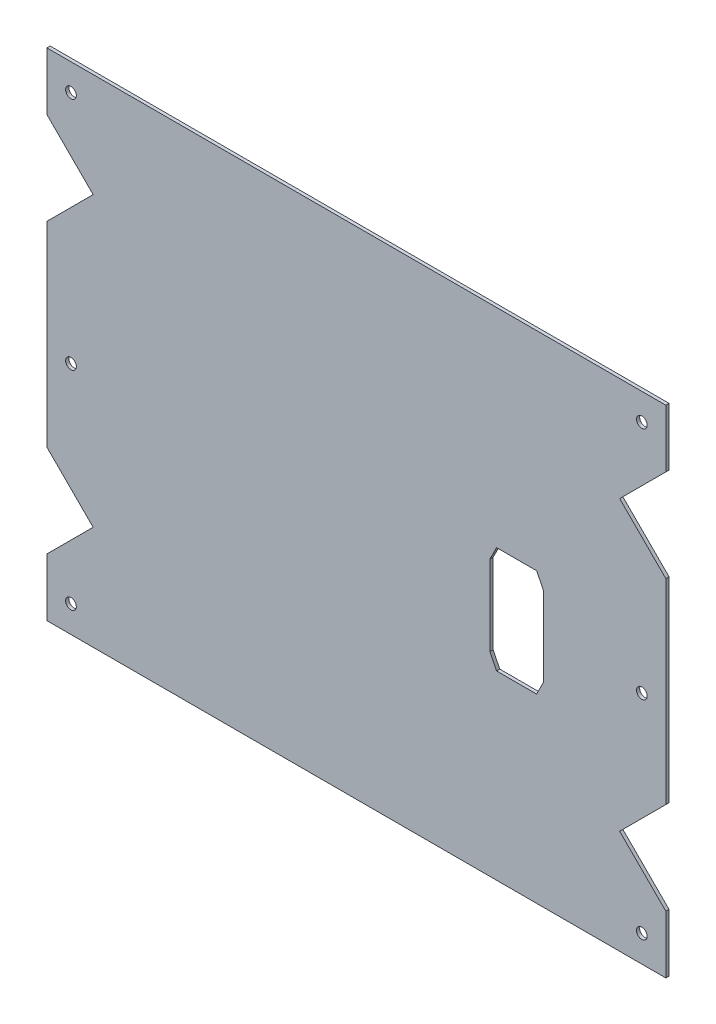
ISO-10303-21;
HEADER;
FILE_DESCRIPTION(('STEP AP214'),'2;1');
FILE_NAME('part.step','',(''),(''),'','','');
FILE_SCHEMA(('AUTOMOTIVE_DESIGN { 1 0 10303 214 1 1 1 1 }'));
ENDSEC;
DATA;
#1=APPLICATION_CONTEXT('core data for automotive mechanical design processes');
#2=APPLICATION_PROTOCOL_DEFINITION('international standard','automotive_design',2000,#1);
#3=PRODUCT_CONTEXT('',#1,'mechanical');
#4=PRODUCT('Part','Part','',(#3));
#5=PRODUCT_RELATED_PRODUCT_CATEGORY('part','',(#4));
#6=PRODUCT_DEFINITION_FORMATION('','',#4);
#7=PRODUCT_DEFINITION_CONTEXT('part definition',#1,'design');
#8=PRODUCT_DEFINITION('design','',#6,#7);
#9=PRODUCT_DEFINITION_SHAPE('','',#8);
#10=(LENGTH_UNIT() NAMED_UNIT(*) SI_UNIT(.MILLI.,.METRE.));
#11=(NAMED_UNIT(*) PLANE_ANGLE_UNIT() SI_UNIT($,.RADIAN.));
#12=(NAMED_UNIT(*) SI_UNIT($,.STERADIAN.) SOLID_ANGLE_UNIT());
#13=UNCERTAINTY_MEASURE_WITH_UNIT(LENGTH_MEASURE(1.E-05),#10,'distance_accuracy_value','');
#14=(GEOMETRIC_REPRESENTATION_CONTEXT(3) GLOBAL_UNCERTAINTY_ASSIGNED_CONTEXT((#13)) GLOBAL_UNIT_ASSIGNED_CONTEXT((#10,
#11,#12)) REPRESENTATION_CONTEXT('',''));
#15=CARTESIAN_POINT('',(0.,0.,0.));
#16=DIRECTION('',(0.,0.,1.));
#17=DIRECTION('',(1.,0.,0.));
#18=AXIS2_PLACEMENT_3D('',#15,#16,#17);
#19=CARTESIAN_POINT('',(0.,0.,-1.2));
#20=DIRECTION('',(0.,0.,-1.));
#21=DIRECTION('',(-1.,0.,0.));
#22=AXIS2_PLACEMENT_3D('',#19,#20,#21);
#23=PLANE('',#22);
#24=DIRECTION('',(-0.707106781186547,-0.707106781186549,0.));
#25=VECTOR('',#24,1.);
#26=CARTESIAN_POINT('',(-99.8236343638063,52.7098466094067,-1.20000000000003));
#27=LINE('',#26,#25);
#28=CARTESIAN_POINT('',(-98.5899637913098,53.9435171819032,-1.20000000000004));
#29=VERTEX_POINT('',#28);
#30=CARTESIAN_POINT('',(-115.887034363806,36.6464466094067,-1.20000000000015));
#31=VERTEX_POINT('',#30);
#32=EDGE_CURVE('E710',#29,#31,#27,.T.);
#33=ORIENTED_EDGE('',*,*,#32,.F.);
#34=DIRECTION('',(0.707106781186547,-0.707106781186548,0.));
#35=VECTOR('',#34,1.);
#36=CARTESIAN_POINT('',(-128.81936983357,84.1729232241631,-1.20000000000049));
#37=LINE('',#36,#35);
#38=CARTESIAN_POINT('',(-115.887034363806,71.2405877543997,-1.20000000000029));
#39=VERTEX_POINT('',#38);
#40=EDGE_CURVE('E725',#39,#29,#37,.T.);
#41=ORIENTED_EDGE('',*,*,#40,.F.);
#42=DIRECTION('',(0.,1.,0.));
#43=VECTOR('',#42,1.);
#44=CARTESIAN_POINT('',(-115.887034363806,54.0870343638061,-1.20000000000013));
#45=LINE('',#44,#43);
#46=CARTESIAN_POINT('',(-115.887034363806,92.8870343638064,-1.20000000000048));
#47=VERTEX_POINT('',#46);
#48=EDGE_CURVE('E721',#39,#47,#45,.T.);
#49=ORIENTED_EDGE('',*,*,#48,.T.);
#50=DIRECTION('',(1.,0.,0.));
#51=VECTOR('',#50,1.);
#52=CARTESIAN_POINT('',(-152.887034363806,92.8870343638063,-1.20000000000072));
#53=LINE('',#52,#51);
#54=CARTESIAN_POINT('',(115.887034363806,92.8870343638064,-1.20000000000044));
#55=VERTEX_POINT('',#54);
#56=EDGE_CURVE('E752',#47,#55,#53,.T.);
#57=ORIENTED_EDGE('',*,*,#56,.T.);
#58=DIRECTION('',(0.,-1.,0.));
#59=VECTOR('',#58,1.);
#60=CARTESIAN_POINT('',(115.887034363806,54.0870343638061,-1.20000000000009));
#61=LINE('',#60,#59);
#62=CARTESIAN_POINT('',(115.887034363806,71.2405877543997,-1.20000000000025));
#63=VERTEX_POINT('',#62);
#64=EDGE_CURVE('E746',#55,#63,#61,.T.);
#65=ORIENTED_EDGE('',*,*,#64,.T.);
#66=DIRECTION('',(0.707106781186547,0.707106781186548,0.));
#67=VECTOR('',#66,1.);
#68=CARTESIAN_POINT('',(99.8236343638063,55.1771877543997,-1.19999999999999));
#69=LINE('',#68,#67);
#70=CARTESIAN_POINT('',(98.5899637913099,53.9435171819032,-1.19999999999997));
#71=VERTEX_POINT('',#70);
#72=EDGE_CURVE('E744',#71,#63,#69,.T.);
#73=ORIENTED_EDGE('',*,*,#72,.F.);
#74=DIRECTION('',(-0.707106781186546,0.707106781186549,0.));
#75=VECTOR('',#74,1.);
#76=CARTESIAN_POINT('',(175.231805465845,-22.6983244926323,-1.20000000000062));
#77=LINE('',#76,#75);
#78=CARTESIAN_POINT('',(115.887034363806,36.6464466094067,-1.20000000000016));
#79=VERTEX_POINT('',#78);
#80=EDGE_CURVE('E860',#79,#71,#77,.T.);
#81=ORIENTED_EDGE('',*,*,#80,.F.);
#82=DIRECTION('',(0.,-1.,0.));
#83=VECTOR('',#82,1.);
#84=CARTESIAN_POINT('',(115.887034363806,0.,-1.20000000000017));
#85=LINE('',#84,#83);
#86=CARTESIAN_POINT('',(115.887034363806,-36.6464466094066,-1.20000000000019));
#87=VERTEX_POINT('',#86);
#88=EDGE_CURVE('E866',#79,#87,#85,.T.);
#89=ORIENTED_EDGE('',*,*,#88,.T.);
#90=DIRECTION('',(0.707106781186546,0.707106781186549,0.));
#91=VECTOR('',#90,1.);
#92=CARTESIAN_POINT('',(99.8236343638063,-52.7098466094067,-1.20000000000009));
#93=LINE('',#92,#91);
#94=CARTESIAN_POINT('',(98.5899637913099,-53.9435171819032,-1.20000000000009));
#95=VERTEX_POINT('',#94);
#96=EDGE_CURVE('E851',#95,#87,#93,.T.);
#97=ORIENTED_EDGE('',*,*,#96,.F.);
#98=DIRECTION('',(-0.707106781186547,0.707106781186548,0.));
#99=VECTOR('',#98,1.);
#100=CARTESIAN_POINT('',(128.81936983357,-84.1729232241631,-1.20000000000045));
#101=LINE('',#100,#99);
#102=CARTESIAN_POINT('',(115.887034363806,-71.2405877543996,-1.20000000000028));
#103=VERTEX_POINT('',#102);
#104=EDGE_CURVE('E778',#103,#95,#101,.T.);
#105=ORIENTED_EDGE('',*,*,#104,.F.);
#106=DIRECTION('',(0.,-1.,0.));
#107=VECTOR('',#106,1.);
#108=CARTESIAN_POINT('',(115.887034363806,-54.0870343638062,-1.20000000000015));
#109=LINE('',#108,#107);
#110=CARTESIAN_POINT('',(115.887034363806,-92.8870343638064,-1.20000000000044));
#111=VERTEX_POINT('',#110);
#112=EDGE_CURVE('E789',#103,#111,#109,.T.);
#113=ORIENTED_EDGE('',*,*,#112,.T.);
#114=DIRECTION('',(-1.,0.,0.));
#115=VECTOR('',#114,1.);
#116=CARTESIAN_POINT('',(-152.887034363806,-92.8870343638063,-1.20000000000063));
#117=LINE('',#116,#115);
#118=CARTESIAN_POINT('',(-115.887034363806,-92.8870343638063,-1.20000000000039));
#119=VERTEX_POINT('',#118);
#120=EDGE_CURVE('E798',#111,#119,#117,.T.);
#121=ORIENTED_EDGE('',*,*,#120,.T.);
#122=DIRECTION('',(0.,1.,0.));
#123=VECTOR('',#122,1.);
#124=CARTESIAN_POINT('',(-115.887034363806,-54.0870343638059,-1.19999999999999));
#125=LINE('',#124,#123);
#126=CARTESIAN_POINT('',(-115.887034363806,-71.2405877543997,-1.20000000000017));
#127=VERTEX_POINT('',#126);
#128=EDGE_CURVE('E795',#119,#127,#125,.T.);
#129=ORIENTED_EDGE('',*,*,#128,.T.);
#130=DIRECTION('',(-0.707106781186547,-0.707106781186548,0.));
#131=VECTOR('',#130,1.);
#132=CARTESIAN_POINT('',(-99.8236343638063,-55.1771877543996,-1.19999999999988));
#133=LINE('',#132,#131);
#134=CARTESIAN_POINT('',(-98.5899637913099,-53.9435171819032,-1.19999999999986));
#135=VERTEX_POINT('',#134);
#136=EDGE_CURVE('E787',#135,#127,#133,.T.);
#137=ORIENTED_EDGE('',*,*,#136,.F.);
#138=DIRECTION('',(0.707106781186546,-0.707106781186549,0.));
#139=VECTOR('',#138,1.);
#140=CARTESIAN_POINT('',(-175.231805465845,22.6983244926323,-1.20000000000058));
#141=LINE('',#140,#139);
#142=CARTESIAN_POINT('',(-115.887034363806,-36.6464466094066,-1.20000000000012));
#143=VERTEX_POINT('',#142);
#144=EDGE_CURVE('E833',#143,#135,#141,.T.);
#145=ORIENTED_EDGE('',*,*,#144,.F.);
#146=DIRECTION('',(0.,1.,0.));
#147=VECTOR('',#146,1.);
#148=CARTESIAN_POINT('',(-115.887034363806,0.,-1.20000000000013));
#149=LINE('',#148,#147);
#150=EDGE_CURVE('E839',#143,#31,#149,.T.);
#151=ORIENTED_EDGE('',*,*,#150,.T.);
#152=EDGE_LOOP('',(#33,#41,#49,#57,#65,#73,#81,#89,#97,#105,#113,#121,#129,#137,#145,#151));
#153=FACE_BOUND('',#152,.T.);
#154=DIRECTION('',(0.,-1.,0.));
#155=VECTOR('',#154,1.);
#156=CARTESIAN_POINT('',(70.,10.,-1.2));
#157=LINE('',#156,#155);
#158=CARTESIAN_POINT('',(70.,10.,-1.2));
#159=VERTEX_POINT('',#158);
#160=CARTESIAN_POINT('',(70.,-20.,-1.2));
#161=VERTEX_POINT('',#160);
#162=EDGE_CURVE('E552',#159,#161,#157,.T.);
#163=ORIENTED_EDGE('',*,*,#162,.F.);
#164=DIRECTION('',(0.447213595499958,-0.894427190999916,0.));
#165=VECTOR('',#164,1.);
#166=CARTESIAN_POINT('',(70.,10.,-1.2));
#167=LINE('',#166,#165);
#168=CARTESIAN_POINT('',(67.4999999999999,15.,-1.2));
#169=VERTEX_POINT('',#168);
#170=EDGE_CURVE('E893',#169,#159,#167,.T.);
#171=ORIENTED_EDGE('',*,*,#170,.F.);
#172=DIRECTION('',(1.,0.,0.));
#173=VECTOR('',#172,1.);
#174=CARTESIAN_POINT('',(67.4999999999999,15.,-1.2));
#175=LINE('',#174,#173);
#176=CARTESIAN_POINT('',(52.5,15.,-1.2));
#177=VERTEX_POINT('',#176);
#178=EDGE_CURVE('E890',#177,#169,#175,.T.);
#179=ORIENTED_EDGE('',*,*,#178,.F.);
#180=DIRECTION('',(0.447213595499958,0.894427190999916,0.));
#181=VECTOR('',#180,1.);
#182=CARTESIAN_POINT('',(50.,10.,-1.2));
#183=LINE('',#182,#181);
#184=CARTESIAN_POINT('',(50.,10.,-1.2));
#185=VERTEX_POINT('',#184);
#186=EDGE_CURVE('E887',#185,#177,#183,.T.);
#187=ORIENTED_EDGE('',*,*,#186,.F.);
#188=DIRECTION('',(0.,1.,0.));
#189=VECTOR('',#188,1.);
#190=CARTESIAN_POINT('',(50.,10.,-1.2));
#191=LINE('',#190,#189);
#192=CARTESIAN_POINT('',(50.,-20.,-1.2));
#193=VERTEX_POINT('',#192);
#194=EDGE_CURVE('E884',#193,#185,#191,.T.);
#195=ORIENTED_EDGE('',*,*,#194,.F.);
#196=DIRECTION('',(-0.447213595499958,0.894427190999916,0.));
#197=VECTOR('',#196,1.);
#198=CARTESIAN_POINT('',(52.5,-25.,-1.2));
#199=LINE('',#198,#197);
#200=CARTESIAN_POINT('',(52.5,-25.,-1.2));
#201=VERTEX_POINT('',#200);
#202=EDGE_CURVE('E881',#201,#193,#199,.T.);
#203=ORIENTED_EDGE('',*,*,#202,.F.);
#204=DIRECTION('',(-1.,0.,0.));
#205=VECTOR('',#204,1.);
#206=CARTESIAN_POINT('',(67.5,-25.,-1.2));
#207=LINE('',#206,#205);
#208=CARTESIAN_POINT('',(67.5,-25.,-1.2));
#209=VERTEX_POINT('',#208);
#210=EDGE_CURVE('E878',#209,#201,#207,.T.);
#211=ORIENTED_EDGE('',*,*,#210,.F.);
#212=DIRECTION('',(-0.447213595499958,-0.894427190999916,0.));
#213=VECTOR('',#212,1.);
#214=CARTESIAN_POINT('',(67.5,-25.,-1.2));
#215=LINE('',#214,#213);
#216=EDGE_CURVE('E876',#161,#209,#215,.T.);
#217=ORIENTED_EDGE('',*,*,#216,.F.);
#218=EDGE_LOOP('',(#163,#171,#179,#187,#195,#203,#211,#217));
#219=FACE_BOUND('',#218,.T.);
#220=CARTESIAN_POINT('',(106.887034363807,-4.99999999999997,-1.2000000000003));
#221=DIRECTION('',(0.,0.,1.));
#222=DIRECTION('',(1.,0.,0.));
#223=AXIS2_PLACEMENT_3D('',#220,#221,#222);
#224=CIRCLE('',#223,2.);
#225=CARTESIAN_POINT('',(108.887034363807,-4.99999999999997,-1.2000000000003));
#226=VERTEX_POINT('',#225);
#227=EDGE_CURVE('E868',#226,#226,#224,.T.);
#228=ORIENTED_EDGE('',*,*,#227,.T.);
#229=EDGE_LOOP('',(#228));
#230=FACE_BOUND('',#229,.T.);
#231=CARTESIAN_POINT('',(-106.887034363806,-5.00000000000014,-1.20000000000006));
#232=DIRECTION('',(0.,0.,-1.));
#233=DIRECTION('',(-1.,0.,0.));
#234=AXIS2_PLACEMENT_3D('',#231,#232,#233);
#235=CIRCLE('',#234,2.);
#236=CARTESIAN_POINT('',(-108.887034363806,-5.00000000000014,-1.20000000000008));
#237=VERTEX_POINT('',#236);
#238=EDGE_CURVE('E841',#237,#237,#235,.T.);
#239=ORIENTED_EDGE('',*,*,#238,.F.);
#240=EDGE_LOOP('',(#239));
#241=FACE_BOUND('',#240,.T.);
#242=CARTESIAN_POINT('',(106.887034363807,-82.8870343638069,-1.20000000000044));
#243=DIRECTION('',(0.,0.,1.));
#244=DIRECTION('',(0.,-1.,0.));
#245=AXIS2_PLACEMENT_3D('',#242,#243,#244);
#246=CIRCLE('',#245,2.);
#247=CARTESIAN_POINT('',(106.887034363807,-84.8870343638069,-1.20000000000045));
#248=VERTEX_POINT('',#247);
#249=EDGE_CURVE('E792',#248,#248,#246,.T.);
#250=ORIENTED_EDGE('',*,*,#249,.T.);
#251=EDGE_LOOP('',(#250));
#252=FACE_BOUND('',#251,.T.);
#253=CARTESIAN_POINT('',(-106.887034363806,-82.8870343638063,-1.20000000000019));
#254=DIRECTION('',(0.,0.,-1.));
#255=DIRECTION('',(0.,-1.,0.));
#256=AXIS2_PLACEMENT_3D('',#253,#254,#255);
#257=CIRCLE('',#256,2.);
#258=CARTESIAN_POINT('',(-106.887034363806,-84.8870343638063,-1.20000000000022));
#259=VERTEX_POINT('',#258);
#260=EDGE_CURVE('E823',#259,#259,#257,.T.);
#261=ORIENTED_EDGE('',*,*,#260,.F.);
#262=EDGE_LOOP('',(#261));
#263=FACE_BOUND('',#262,.T.);
#264=CARTESIAN_POINT('',(106.887034363806,82.887034363807,-1.20000000000035));
#265=DIRECTION('',(0.,0.,1.));
#266=DIRECTION('',(0.,1.,0.));
#267=AXIS2_PLACEMENT_3D('',#264,#265,#266);
#268=CIRCLE('',#267,2.);
#269=CARTESIAN_POINT('',(106.887034363806,84.887034363807,-1.20000000000036));
#270=VERTEX_POINT('',#269);
#271=EDGE_CURVE('E749',#270,#270,#268,.T.);
#272=ORIENTED_EDGE('',*,*,#271,.T.);
#273=EDGE_LOOP('',(#272));
#274=FACE_BOUND('',#273,.T.);
#275=CARTESIAN_POINT('',(-106.887034363806,82.8870343638064,-1.20000000000037));
#276=DIRECTION('',(0.,0.,-1.));
#277=DIRECTION('',(0.,1.,0.));
#278=AXIS2_PLACEMENT_3D('',#275,#276,#277);
#279=CIRCLE('',#278,2.);
#280=CARTESIAN_POINT('',(-106.887034363806,84.8870343638064,-1.20000000000039));
#281=VERTEX_POINT('',#280);
#282=EDGE_CURVE('E768',#281,#281,#279,.T.);
#283=ORIENTED_EDGE('',*,*,#282,.F.);
#284=EDGE_LOOP('',(#283));
#285=FACE_BOUND('',#284,.T.);
#286=ADVANCED_FACE('F537',(#153,#219,#230,#241,#252,#263,#274,#285),#23,.T.);
#287=CARTESIAN_POINT('',(0.,0.,0.));
#288=DIRECTION('',(0.,0.,-1.));
#289=DIRECTION('',(-1.,0.,0.));
#290=AXIS2_PLACEMENT_3D('',#287,#288,#289);
#291=PLANE('',#290);
#292=DIRECTION('',(0.707106781186547,-0.707106781186548,0.));
#293=VECTOR('',#292,1.);
#294=CARTESIAN_POINT('',(-125.810257668509,81.1638110591027,-4.30211422042248E-13));
#295=LINE('',#294,#293);
#296=CARTESIAN_POINT('',(-115.887034363806,71.2405877543997,-2.84494650060196E-13));
#297=VERTEX_POINT('',#296);
#298=CARTESIAN_POINT('',(-98.5899637913098,53.9435171819032,0.));
#299=VERTEX_POINT('',#298);
#300=EDGE_CURVE('E715',#297,#299,#295,.T.);
#301=ORIENTED_EDGE('',*,*,#300,.T.);
#302=DIRECTION('',(-0.707106781186546,-0.707106781186549,0.));
#303=VECTOR('',#302,1.);
#304=CARTESIAN_POINT('',(-125.81025766851,26.7232233047034,-2.08166817117217E-13));
#305=LINE('',#304,#303);
#306=CARTESIAN_POINT('',(-115.887034363806,36.6464466094067,0.));
#307=VERTEX_POINT('',#306);
#308=EDGE_CURVE('E700',#299,#307,#305,.T.);
#309=ORIENTED_EDGE('',*,*,#308,.T.);
#310=DIRECTION('',(0.,-1.,0.));
#311=VECTOR('',#310,1.);
#312=CARTESIAN_POINT('',(-115.887034363806,53.0634,-1.38777878078145E-13));
#313=LINE('',#312,#311);
#314=CARTESIAN_POINT('',(-115.887034363806,-36.6464466094066,-1.11022302462516E-13));
#315=VERTEX_POINT('',#314);
#316=EDGE_CURVE('E781',#315,#307,#313,.F.);
#317=ORIENTED_EDGE('',*,*,#316,.F.);
#318=DIRECTION('',(0.707106781186546,-0.707106781186549,0.));
#319=VECTOR('',#318,1.);
#320=CARTESIAN_POINT('',(-125.810257668509,-26.7232233047034,-1.80411241501588E-13));
#321=LINE('',#320,#319);
#322=CARTESIAN_POINT('',(-98.5899637913099,-53.9435171819032,1.37693675905659E-13));
#323=VERTEX_POINT('',#322);
#324=EDGE_CURVE('E711',#315,#323,#321,.T.);
#325=ORIENTED_EDGE('',*,*,#324,.T.);
#326=DIRECTION('',(-0.707106781186547,-0.707106781186548,0.));
#327=VECTOR('',#326,1.);
#328=CARTESIAN_POINT('',(-125.810257668509,-81.1638110591026,-3.2612801348364E-13));
#329=LINE('',#328,#327);
#330=CARTESIAN_POINT('',(-115.887034363806,-71.2405877543997,-1.2490009027033E-13));
#331=VERTEX_POINT('',#330);
#332=EDGE_CURVE('E806',#323,#331,#329,.T.);
#333=ORIENTED_EDGE('',*,*,#332,.T.);
#334=DIRECTION('',(0.,-1.,0.));
#335=VECTOR('',#334,1.);
#336=CARTESIAN_POINT('',(-115.887034363806,-54.8236343638062,0.));
#337=LINE('',#336,#335);
#338=CARTESIAN_POINT('',(-115.887034363806,-92.8870343638063,-3.81639164714898E-13));
#339=VERTEX_POINT('',#338);
#340=EDGE_CURVE('E809',#339,#331,#337,.F.);
#341=ORIENTED_EDGE('',*,*,#340,.F.);
#342=DIRECTION('',(1.,0.,0.));
#343=VECTOR('',#342,1.);
#344=CARTESIAN_POINT('',(-115.887034363806,-92.8870343638063,-3.81639164714898E-13));
#345=LINE('',#344,#343);
#346=CARTESIAN_POINT('',(115.887034363806,-92.8870343638064,-4.37150315946155E-13));
#347=VERTEX_POINT('',#346);
#348=EDGE_CURVE('E821',#347,#339,#345,.F.);
#349=ORIENTED_EDGE('',*,*,#348,.F.);
#350=DIRECTION('',(0.,1.,0.));
#351=VECTOR('',#350,1.);
#352=CARTESIAN_POINT('',(115.887034363806,-92.8870343638064,-4.37150315946155E-13));
#353=LINE('',#352,#351);
#354=CARTESIAN_POINT('',(115.887034363806,-71.2405877543997,-2.77555756156289E-13));
#355=VERTEX_POINT('',#354);
#356=EDGE_CURVE('E803',#355,#347,#353,.F.);
#357=ORIENTED_EDGE('',*,*,#356,.F.);
#358=DIRECTION('',(-0.707106781186547,0.707106781186548,0.));
#359=VECTOR('',#358,1.);
#360=CARTESIAN_POINT('',(125.810257668509,-81.1638110591027,-4.09394740330526E-13));
#361=LINE('',#360,#359);
#362=CARTESIAN_POINT('',(98.5899637913099,-53.9435171819032,0.));
#363=VERTEX_POINT('',#362);
#364=EDGE_CURVE('E800',#355,#363,#361,.T.);
#365=ORIENTED_EDGE('',*,*,#364,.T.);
#366=DIRECTION('',(0.707106781186546,0.707106781186549,0.));
#367=VECTOR('',#366,1.);
#368=CARTESIAN_POINT('',(125.81025766851,-26.7232233047034,-2.4980018054066E-13));
#369=LINE('',#368,#367);
#370=CARTESIAN_POINT('',(115.887034363806,-36.6464466094066,-1.38777878078145E-13));
#371=VERTEX_POINT('',#370);
#372=EDGE_CURVE('E854',#363,#371,#369,.T.);
#373=ORIENTED_EDGE('',*,*,#372,.T.);
#374=DIRECTION('',(0.,1.,0.));
#375=VECTOR('',#374,1.);
#376=CARTESIAN_POINT('',(115.887034363806,-53.0634,-1.94289029309402E-13));
#377=LINE('',#376,#375);
#378=CARTESIAN_POINT('',(115.887034363806,36.6464466094067,-1.52655665885959E-13));
#379=VERTEX_POINT('',#378);
#380=EDGE_CURVE('E829',#379,#371,#377,.F.);
#381=ORIENTED_EDGE('',*,*,#380,.F.);
#382=DIRECTION('',(-0.707106781186546,0.707106781186549,0.));
#383=VECTOR('',#382,1.);
#384=CARTESIAN_POINT('',(125.81025766851,26.7232233047035,-2.22044604925031E-13));
#385=LINE('',#384,#383);
#386=CARTESIAN_POINT('',(98.5899637913099,53.9435171819033,0.));
#387=VERTEX_POINT('',#386);
#388=EDGE_CURVE('E857',#379,#387,#385,.T.);
#389=ORIENTED_EDGE('',*,*,#388,.T.);
#390=DIRECTION('',(0.707106781186547,0.707106781186548,0.));
#391=VECTOR('',#390,1.);
#392=CARTESIAN_POINT('',(125.810257668509,81.1638110591027,-3.88578058618805E-13));
#393=LINE('',#392,#391);
#394=CARTESIAN_POINT('',(115.887034363806,71.2405877543997,-2.28983498828939E-13));
#395=VERTEX_POINT('',#394);
#396=EDGE_CURVE('E756',#387,#395,#393,.T.);
#397=ORIENTED_EDGE('',*,*,#396,.T.);
#398=DIRECTION('',(0.,1.,0.));
#399=VECTOR('',#398,1.);
#400=CARTESIAN_POINT('',(115.887034363806,54.8236343638065,0.));
#401=LINE('',#400,#399);
#402=CARTESIAN_POINT('',(115.887034363806,92.8870343638064,-4.30211422042248E-13));
#403=VERTEX_POINT('',#402);
#404=EDGE_CURVE('E759',#403,#395,#401,.F.);
#405=ORIENTED_EDGE('',*,*,#404,.F.);
#406=DIRECTION('',(-1.,0.,0.));
#407=VECTOR('',#406,1.);
#408=CARTESIAN_POINT('',(-99.0870343638063,92.8870343638064,-3.46944695195361E-13));
#409=LINE('',#408,#407);
#410=CARTESIAN_POINT('',(-115.887034363806,92.8870343638064,-4.71844785465692E-13));
#411=VERTEX_POINT('',#410);
#412=EDGE_CURVE('E774',#411,#403,#409,.F.);
#413=ORIENTED_EDGE('',*,*,#412,.F.);
#414=DIRECTION('',(0.,-1.,0.));
#415=VECTOR('',#414,1.);
#416=CARTESIAN_POINT('',(-115.887034363806,92.8870343638064,-4.71844785465692E-13));
#417=LINE('',#416,#415);
#418=EDGE_CURVE('E718',#297,#411,#417,.F.);
#419=ORIENTED_EDGE('',*,*,#418,.F.);
#420=EDGE_LOOP('',(#301,#309,#317,#325,#333,#341,#349,#357,#365,#373,#381,#389,#397,#405,#413,#419));
#421=FACE_BOUND('',#420,.T.);
#422=DIRECTION('',(0.447213595499958,-0.894427190999916,0.));
#423=VECTOR('',#422,1.);
#424=CARTESIAN_POINT('',(59.9999999999999,30.,0.));
#425=LINE('',#424,#423);
#426=CARTESIAN_POINT('',(67.4999999999999,15.,0.));
#427=VERTEX_POINT('',#426);
#428=CARTESIAN_POINT('',(70.,10.,0.));
#429=VERTEX_POINT('',#428);
#430=EDGE_CURVE('E545',#427,#429,#425,.T.);
#431=ORIENTED_EDGE('',*,*,#430,.T.);
#432=DIRECTION('',(0.,-1.,0.));
#433=VECTOR('',#432,1.);
#434=CARTESIAN_POINT('',(70.,0.,0.));
#435=LINE('',#434,#433);
#436=CARTESIAN_POINT('',(70.,-20.,0.));
#437=VERTEX_POINT('',#436);
#438=EDGE_CURVE('E13',#429,#437,#435,.T.);
#439=ORIENTED_EDGE('',*,*,#438,.T.);
#440=DIRECTION('',(-0.447213595499958,-0.894427190999916,0.));
#441=VECTOR('',#440,1.);
#442=CARTESIAN_POINT('',(64.,-32.,0.));
#443=LINE('',#442,#441);
#444=CARTESIAN_POINT('',(67.5,-25.,0.));
#445=VERTEX_POINT('',#444);
#446=EDGE_CURVE('E899',#437,#445,#443,.T.);
#447=ORIENTED_EDGE('',*,*,#446,.T.);
#448=DIRECTION('',(-1.,0.,0.));
#449=VECTOR('',#448,1.);
#450=CARTESIAN_POINT('',(0.,-25.,0.));
#451=LINE('',#450,#449);
#452=CARTESIAN_POINT('',(52.5,-25.,0.));
#453=VERTEX_POINT('',#452);
#454=EDGE_CURVE('E914',#445,#453,#451,.T.);
#455=ORIENTED_EDGE('',*,*,#454,.T.);
#456=DIRECTION('',(-0.447213595499958,0.894427190999916,0.));
#457=VECTOR('',#456,1.);
#458=CARTESIAN_POINT('',(32.,16.,0.));
#459=LINE('',#458,#457);
#460=CARTESIAN_POINT('',(50.,-20.,0.));
#461=VERTEX_POINT('',#460);
#462=EDGE_CURVE('E917',#453,#461,#459,.T.);
#463=ORIENTED_EDGE('',*,*,#462,.T.);
#464=DIRECTION('',(0.,1.,0.));
#465=VECTOR('',#464,1.);
#466=CARTESIAN_POINT('',(50.,0.,0.));
#467=LINE('',#466,#465);
#468=CARTESIAN_POINT('',(50.,10.,0.));
#469=VERTEX_POINT('',#468);
#470=EDGE_CURVE('E920',#461,#469,#467,.T.);
#471=ORIENTED_EDGE('',*,*,#470,.T.);
#472=DIRECTION('',(0.447213595499958,0.894427190999916,0.));
#473=VECTOR('',#472,1.);
#474=CARTESIAN_POINT('',(35.9999999999999,-18.,0.));
#475=LINE('',#474,#473);
#476=CARTESIAN_POINT('',(52.5,15.,0.));
#477=VERTEX_POINT('',#476);
#478=EDGE_CURVE('E923',#469,#477,#475,.T.);
#479=ORIENTED_EDGE('',*,*,#478,.T.);
#480=DIRECTION('',(1.,0.,0.));
#481=VECTOR('',#480,1.);
#482=CARTESIAN_POINT('',(0.,15.,0.));
#483=LINE('',#482,#481);
#484=EDGE_CURVE('E926',#477,#427,#483,.T.);
#485=ORIENTED_EDGE('',*,*,#484,.T.);
#486=EDGE_LOOP('',(#431,#439,#447,#455,#463,#471,#479,#485));
#487=FACE_BOUND('',#486,.T.);
#488=CARTESIAN_POINT('',(106.887034363807,-4.99999999999997,-1.11022302462516E-13));
#489=DIRECTION('',(0.,0.,1.));
#490=DIRECTION('',(1.,0.,0.));
#491=AXIS2_PLACEMENT_3D('',#488,#489,#490);
#492=CIRCLE('',#491,2.);
#493=CARTESIAN_POINT('',(108.887034363807,-4.99999999999997,-1.24613735524875E-13));
#494=VERTEX_POINT('',#493);
#495=EDGE_CURVE('E871',#494,#494,#492,.T.);
#496=ORIENTED_EDGE('',*,*,#495,.F.);
#497=EDGE_LOOP('',(#496));
#498=FACE_BOUND('',#497,.T.);
#499=CARTESIAN_POINT('',(-106.887034363806,-5.00000000000014,0.));
#500=DIRECTION('',(0.,0.,1.));
#501=DIRECTION('',(1.,0.,0.));
#502=AXIS2_PLACEMENT_3D('',#499,#500,#501);
#503=CIRCLE('',#502,2.);
#504=CARTESIAN_POINT('',(-104.887034363806,-5.00000000000014,0.));
#505=VERTEX_POINT('',#504);
#506=EDGE_CURVE('E844',#505,#505,#503,.T.);
#507=ORIENTED_EDGE('',*,*,#506,.F.);
#508=EDGE_LOOP('',(#507));
#509=FACE_BOUND('',#508,.T.);
#510=CARTESIAN_POINT('',(106.887034363807,-82.8870343638069,-2.98372437868011E-13));
#511=DIRECTION('',(0.,0.,1.));
#512=DIRECTION('',(-1.,0.,0.));
#513=AXIS2_PLACEMENT_3D('',#510,#511,#512);
#514=CIRCLE('',#513,2.);
#515=CARTESIAN_POINT('',(104.887034363807,-82.8870343638069,-2.84633814719786E-13));
#516=VERTEX_POINT('',#515);
#517=EDGE_CURVE('E815',#516,#516,#514,.T.);
#518=ORIENTED_EDGE('',*,*,#517,.F.);
#519=EDGE_LOOP('',(#518));
#520=FACE_BOUND('',#519,.T.);
#521=CARTESIAN_POINT('',(-106.887034363806,-82.8870343638063,-2.15105711021124E-13));
#522=DIRECTION('',(0.,0.,1.));
#523=DIRECTION('',(-1.,0.,0.));
#524=AXIS2_PLACEMENT_3D('',#521,#522,#523);
#525=CIRCLE('',#524,2.);
#526=CARTESIAN_POINT('',(-108.887034363806,-82.8870343638063,-2.28549953997618E-13));
#527=VERTEX_POINT('',#526);
#528=EDGE_CURVE('E739',#527,#527,#525,.T.);
#529=ORIENTED_EDGE('',*,*,#528,.F.);
#530=EDGE_LOOP('',(#529));
#531=FACE_BOUND('',#530,.T.);
#532=CARTESIAN_POINT('',(-106.887034363806,82.8870343638064,-3.33066907387547E-13));
#533=DIRECTION('',(0.,0.,1.));
#534=DIRECTION('',(1.,0.,0.));
#535=AXIS2_PLACEMENT_3D('',#532,#533,#534);
#536=CIRCLE('',#535,2.);
#537=CARTESIAN_POINT('',(-104.887034363806,82.8870343638064,-3.19622664411053E-13));
#538=VERTEX_POINT('',#537);
#539=EDGE_CURVE('E771',#538,#538,#536,.T.);
#540=ORIENTED_EDGE('',*,*,#539,.F.);
#541=EDGE_LOOP('',(#540));
#542=FACE_BOUND('',#541,.T.);
#543=CARTESIAN_POINT('',(106.887034363806,82.887034363807,-2.77555756156289E-13));
#544=DIRECTION('',(0.,0.,1.));
#545=DIRECTION('',(1.,0.,0.));
#546=AXIS2_PLACEMENT_3D('',#543,#544,#545);
#547=CIRCLE('',#546,2.);
#548=CARTESIAN_POINT('',(108.887034363806,82.887034363807,-2.91294379304514E-13));
#549=VERTEX_POINT('',#548);
#550=EDGE_CURVE('E765',#549,#549,#547,.T.);
#551=ORIENTED_EDGE('',*,*,#550,.F.);
#552=EDGE_LOOP('',(#551));
#553=FACE_BOUND('',#552,.T.);
#554=ADVANCED_FACE('F539',(#421,#487,#498,#509,#520,#531,#542,#553),#291,.F.);
#555=CARTESIAN_POINT('',(70.,10.,38.8000000000001));
#556=DIRECTION('',(1.,0.,0.));
#557=DIRECTION('',(0.,1.,0.));
#558=AXIS2_PLACEMENT_3D('',#555,#556,#557);
#559=PLANE('',#558);
#560=DIRECTION('',(0.,0.,-1.));
#561=VECTOR('',#560,1.);
#562=CARTESIAN_POINT('',(70.,10.,38.8000000000001));
#563=LINE('',#562,#561);
#564=EDGE_CURVE('E897',#429,#159,#563,.T.);
#565=ORIENTED_EDGE('',*,*,#564,.T.);
#566=ORIENTED_EDGE('',*,*,#162,.T.);
#567=DIRECTION('',(0.,0.,-1.));
#568=VECTOR('',#567,1.);
#569=CARTESIAN_POINT('',(70.,-20.,38.8000000000001));
#570=LINE('',#569,#568);
#571=EDGE_CURVE('E896',#437,#161,#570,.T.);
#572=ORIENTED_EDGE('',*,*,#571,.F.);
#573=ORIENTED_EDGE('',*,*,#438,.F.);
#574=EDGE_LOOP('',(#565,#566,#572,#573));
#575=FACE_BOUND('',#574,.T.);
#576=ADVANCED_FACE('F946',(#575),#559,.F.);
#577=CARTESIAN_POINT('',(70.,10.,38.8000000000001));
#578=DIRECTION('',(0.894427190999916,0.447213595499958,0.));
#579=DIRECTION('',(-0.447213595499958,0.894427190999916,0.));
#580=AXIS2_PLACEMENT_3D('',#577,#578,#579);
#581=PLANE('',#580);
#582=DIRECTION('',(0.,0.,-1.));
#583=VECTOR('',#582,1.);
#584=CARTESIAN_POINT('',(67.4999999999999,15.,38.8000000000001));
#585=LINE('',#584,#583);
#586=EDGE_CURVE('E900',#427,#169,#585,.T.);
#587=ORIENTED_EDGE('',*,*,#586,.T.);
#588=ORIENTED_EDGE('',*,*,#170,.T.);
#589=ORIENTED_EDGE('',*,*,#564,.F.);
#590=ORIENTED_EDGE('',*,*,#430,.F.);
#591=EDGE_LOOP('',(#587,#588,#589,#590));
#592=FACE_BOUND('',#591,.T.);
#593=ADVANCED_FACE('F933',(#592),#581,.F.);
#594=CARTESIAN_POINT('',(67.4999999999999,15.,38.8000000000001));
#595=DIRECTION('',(0.,1.,0.));
#596=DIRECTION('',(0.,0.,1.));
#597=AXIS2_PLACEMENT_3D('',#594,#595,#596);
#598=PLANE('',#597);
#599=DIRECTION('',(0.,0.,-1.));
#600=VECTOR('',#599,1.);
#601=CARTESIAN_POINT('',(52.5,15.,38.8000000000001));
#602=LINE('',#601,#600);
#603=EDGE_CURVE('E902',#477,#177,#602,.T.);
#604=ORIENTED_EDGE('',*,*,#603,.T.);
#605=ORIENTED_EDGE('',*,*,#178,.T.);
#606=ORIENTED_EDGE('',*,*,#586,.F.);
#607=ORIENTED_EDGE('',*,*,#484,.F.);
#608=EDGE_LOOP('',(#604,#605,#606,#607));
#609=FACE_BOUND('',#608,.T.);
#610=ADVANCED_FACE('F935',(#609),#598,.F.);
#611=CARTESIAN_POINT('',(50.,10.,38.8000000000001));
#612=DIRECTION('',(-0.894427190999916,0.447213595499958,0.));
#613=DIRECTION('',(-0.447213595499958,-0.894427190999916,0.));
#614=AXIS2_PLACEMENT_3D('',#611,#612,#613);
#615=PLANE('',#614);
#616=DIRECTION('',(0.,0.,-1.));
#617=VECTOR('',#616,1.);
#618=CARTESIAN_POINT('',(50.,10.,38.8000000000001));
#619=LINE('',#618,#617);
#620=EDGE_CURVE('E904',#469,#185,#619,.T.);
#621=ORIENTED_EDGE('',*,*,#620,.T.);
#622=ORIENTED_EDGE('',*,*,#186,.T.);
#623=ORIENTED_EDGE('',*,*,#603,.F.);
#624=ORIENTED_EDGE('',*,*,#478,.F.);
#625=EDGE_LOOP('',(#621,#622,#623,#624));
#626=FACE_BOUND('',#625,.T.);
#627=ADVANCED_FACE('F1061',(#626),#615,.F.);
#628=CARTESIAN_POINT('',(50.,10.,38.8000000000001));
#629=DIRECTION('',(-1.,0.,0.));
#630=DIRECTION('',(0.,-1.,0.));
#631=AXIS2_PLACEMENT_3D('',#628,#629,#630);
#632=PLANE('',#631);
#633=DIRECTION('',(0.,0.,-1.));
#634=VECTOR('',#633,1.);
#635=CARTESIAN_POINT('',(50.,-20.,38.8000000000001));
#636=LINE('',#635,#634);
#637=EDGE_CURVE('E906',#461,#193,#636,.T.);
#638=ORIENTED_EDGE('',*,*,#637,.T.);
#639=ORIENTED_EDGE('',*,*,#194,.T.);
#640=ORIENTED_EDGE('',*,*,#620,.F.);
#641=ORIENTED_EDGE('',*,*,#470,.F.);
#642=EDGE_LOOP('',(#638,#639,#640,#641));
#643=FACE_BOUND('',#642,.T.);
#644=ADVANCED_FACE('F1064',(#643),#632,.F.);
#645=CARTESIAN_POINT('',(52.5,-25.,38.8000000000001));
#646=DIRECTION('',(-0.894427190999916,-0.447213595499958,0.));
#647=DIRECTION('',(0.447213595499958,-0.894427190999916,0.));
#648=AXIS2_PLACEMENT_3D('',#645,#646,#647);
#649=PLANE('',#648);
#650=DIRECTION('',(0.,0.,-1.));
#651=VECTOR('',#650,1.);
#652=CARTESIAN_POINT('',(52.5,-25.,38.8000000000001));
#653=LINE('',#652,#651);
#654=EDGE_CURVE('E908',#453,#201,#653,.T.);
#655=ORIENTED_EDGE('',*,*,#654,.T.);
#656=ORIENTED_EDGE('',*,*,#202,.T.);
#657=ORIENTED_EDGE('',*,*,#637,.F.);
#658=ORIENTED_EDGE('',*,*,#462,.F.);
#659=EDGE_LOOP('',(#655,#656,#657,#658));
#660=FACE_BOUND('',#659,.T.);
#661=ADVANCED_FACE('F1068',(#660),#649,.F.);
#662=CARTESIAN_POINT('',(67.5,-25.,38.8000000000001));
#663=DIRECTION('',(0.,-1.,0.));
#664=DIRECTION('',(1.,0.,0.));
#665=AXIS2_PLACEMENT_3D('',#662,#663,#664);
#666=PLANE('',#665);
#667=DIRECTION('',(0.,0.,-1.));
#668=VECTOR('',#667,1.);
#669=CARTESIAN_POINT('',(67.5,-25.,38.8000000000001));
#670=LINE('',#669,#668);
#671=EDGE_CURVE('E560',#445,#209,#670,.T.);
#672=ORIENTED_EDGE('',*,*,#671,.T.);
#673=ORIENTED_EDGE('',*,*,#210,.T.);
#674=ORIENTED_EDGE('',*,*,#654,.F.);
#675=ORIENTED_EDGE('',*,*,#454,.F.);
#676=EDGE_LOOP('',(#672,#673,#674,#675));
#677=FACE_BOUND('',#676,.T.);
#678=ADVANCED_FACE('F1072',(#677),#666,.F.);
#679=CARTESIAN_POINT('',(67.5,-25.,38.8000000000001));
#680=DIRECTION('',(0.894427190999916,-0.447213595499958,0.));
#681=DIRECTION('',(0.447213595499958,0.894427190999916,0.));
#682=AXIS2_PLACEMENT_3D('',#679,#680,#681);
#683=PLANE('',#682);
#684=ORIENTED_EDGE('',*,*,#571,.T.);
#685=ORIENTED_EDGE('',*,*,#216,.T.);
#686=ORIENTED_EDGE('',*,*,#671,.F.);
#687=ORIENTED_EDGE('',*,*,#446,.F.);
#688=EDGE_LOOP('',(#684,#685,#686,#687));
#689=FACE_BOUND('',#688,.T.);
#690=ADVANCED_FACE('F945',(#689),#683,.F.);
#691=CARTESIAN_POINT('',(115.887034363806,-53.0634,-1.2000000000002));
#692=DIRECTION('',(-1.,0.,0.));
#693=DIRECTION('',(0.,0.,1.));
#694=AXIS2_PLACEMENT_3D('',#691,#692,#693);
#695=PLANE('',#694);
#696=DIRECTION('',(0.,0.,-1.));
#697=VECTOR('',#696,1.);
#698=CARTESIAN_POINT('',(115.887034363806,36.6464466094067,-1.20000000000015));
#699=LINE('',#698,#697);
#700=EDGE_CURVE('E863',#379,#79,#699,.T.);
#701=ORIENTED_EDGE('',*,*,#700,.F.);
#702=ORIENTED_EDGE('',*,*,#380,.T.);
#703=DIRECTION('',(0.,0.,1.));
#704=VECTOR('',#703,1.);
#705=CARTESIAN_POINT('',(115.887034363806,-36.6464466094066,-1.20000000000019));
#706=LINE('',#705,#704);
#707=EDGE_CURVE('E848',#87,#371,#706,.T.);
#708=ORIENTED_EDGE('',*,*,#707,.F.);
#709=ORIENTED_EDGE('',*,*,#88,.F.);
#710=EDGE_LOOP('',(#701,#702,#708,#709));
#711=FACE_BOUND('',#710,.T.);
#712=ADVANCED_FACE('F993',(#711),#695,.F.);
#713=CARTESIAN_POINT('',(106.887034363807,-4.99999999999997,-1.2000000000003));
#714=DIRECTION('',(0.,0.,1.));
#715=DIRECTION('',(1.,0.,0.));
#716=AXIS2_PLACEMENT_3D('',#713,#714,#715);
#717=CYLINDRICAL_SURFACE('',#716,2.);
#718=ORIENTED_EDGE('',*,*,#495,.T.);
#719=EDGE_LOOP('',(#718));
#720=FACE_BOUND('',#719,.T.);
#721=ORIENTED_EDGE('',*,*,#227,.F.);
#722=EDGE_LOOP('',(#721));
#723=FACE_BOUND('',#722,.T.);
#724=ADVANCED_FACE('F1051',(#720,#723),#717,.F.);
#725=CARTESIAN_POINT('',(175.231805465845,-22.6983244926323,-1.20000000000062));
#726=DIRECTION('',(0.707106781186549,0.707106781186546,0.));
#727=DIRECTION('',(0.707106781186546,-0.707106781186549,0.));
#728=AXIS2_PLACEMENT_3D('',#725,#726,#727);
#729=PLANE('',#728);
#730=ORIENTED_EDGE('',*,*,#388,.F.);
#731=ORIENTED_EDGE('',*,*,#700,.T.);
#732=ORIENTED_EDGE('',*,*,#80,.T.);
#733=DIRECTION('',(0.,0.,-1.));
#734=VECTOR('',#733,1.);
#735=CARTESIAN_POINT('',(98.5899637913099,53.9435171819033,0.));
#736=LINE('',#735,#734);
#737=EDGE_CURVE('E734',#387,#71,#736,.T.);
#738=ORIENTED_EDGE('',*,*,#737,.F.);
#739=EDGE_LOOP('',(#730,#731,#732,#738));
#740=FACE_BOUND('',#739,.T.);
#741=ADVANCED_FACE('F995',(#740),#729,.T.);
#742=CARTESIAN_POINT('',(99.8236343638063,-52.7098466094067,-1.20000000000009));
#743=DIRECTION('',(0.707106781186549,-0.707106781186546,0.));
#744=DIRECTION('',(-0.707106781186546,-0.707106781186549,0.));
#745=AXIS2_PLACEMENT_3D('',#742,#743,#744);
#746=PLANE('',#745);
#747=ORIENTED_EDGE('',*,*,#372,.F.);
#748=DIRECTION('',(0.,0.,-1.));
#749=VECTOR('',#748,1.);
#750=CARTESIAN_POINT('',(98.5899637913099,-53.9435171819032,0.));
#751=LINE('',#750,#749);
#752=EDGE_CURVE('E729',#363,#95,#751,.T.);
#753=ORIENTED_EDGE('',*,*,#752,.T.);
#754=ORIENTED_EDGE('',*,*,#96,.T.);
#755=ORIENTED_EDGE('',*,*,#707,.T.);
#756=EDGE_LOOP('',(#747,#753,#754,#755));
#757=FACE_BOUND('',#756,.T.);
#758=ADVANCED_FACE('F989',(#757),#746,.T.);
#759=CARTESIAN_POINT('',(-115.887034363806,53.0634,-1.20000000000015));
#760=DIRECTION('',(1.,0.,0.));
#761=DIRECTION('',(0.,0.,-1.));
#762=AXIS2_PLACEMENT_3D('',#759,#760,#761);
#763=PLANE('',#762);
#764=DIRECTION('',(0.,0.,-1.));
#765=VECTOR('',#764,1.);
#766=CARTESIAN_POINT('',(-115.887034363806,-36.6464466094066,-1.2000000000001));
#767=LINE('',#766,#765);
#768=EDGE_CURVE('E836',#315,#143,#767,.T.);
#769=ORIENTED_EDGE('',*,*,#768,.F.);
#770=ORIENTED_EDGE('',*,*,#316,.T.);
#771=DIRECTION('',(0.,0.,1.));
#772=VECTOR('',#771,1.);
#773=CARTESIAN_POINT('',(-115.887034363806,36.6464466094067,-1.20000000000015));
#774=LINE('',#773,#772);
#775=EDGE_CURVE('E707',#31,#307,#774,.T.);
#776=ORIENTED_EDGE('',*,*,#775,.F.);
#777=ORIENTED_EDGE('',*,*,#150,.F.);
#778=EDGE_LOOP('',(#769,#770,#776,#777));
#779=FACE_BOUND('',#778,.T.);
#780=ADVANCED_FACE('F962',(#779),#763,.F.);
#781=CARTESIAN_POINT('',(-106.887034363808,-5.,198.8));
#782=DIRECTION('',(0.,0.,-1.));
#783=DIRECTION('',(-1.,0.,0.));
#784=AXIS2_PLACEMENT_3D('',#781,#782,#783);
#785=CYLINDRICAL_SURFACE('',#784,2.);
#786=ORIENTED_EDGE('',*,*,#506,.T.);
#787=EDGE_LOOP('',(#786));
#788=FACE_BOUND('',#787,.T.);
#789=ORIENTED_EDGE('',*,*,#238,.T.);
#790=EDGE_LOOP('',(#789));
#791=FACE_BOUND('',#790,.T.);
#792=ADVANCED_FACE('F1041',(#788,#791),#785,.F.);
#793=CARTESIAN_POINT('',(-175.231805465845,22.6983244926323,-1.20000000000058));
#794=DIRECTION('',(-0.707106781186549,-0.707106781186546,0.));
#795=DIRECTION('',(0.707106781186546,-0.707106781186549,0.));
#796=AXIS2_PLACEMENT_3D('',#793,#794,#795);
#797=PLANE('',#796);
#798=ORIENTED_EDGE('',*,*,#324,.F.);
#799=ORIENTED_EDGE('',*,*,#768,.T.);
#800=ORIENTED_EDGE('',*,*,#144,.T.);
#801=DIRECTION('',(0.,0.,-1.));
#802=VECTOR('',#801,1.);
#803=CARTESIAN_POINT('',(-98.5899637913099,-53.9435171819032,1.37693675905659E-13));
#804=LINE('',#803,#802);
#805=EDGE_CURVE('E726',#323,#135,#804,.T.);
#806=ORIENTED_EDGE('',*,*,#805,.F.);
#807=EDGE_LOOP('',(#798,#799,#800,#806));
#808=FACE_BOUND('',#807,.T.);
#809=ADVANCED_FACE('F966',(#808),#797,.T.);
#810=CARTESIAN_POINT('',(-99.8236343638063,52.7098466094067,-1.20000000000003));
#811=DIRECTION('',(-0.707106781186549,0.707106781186546,0.));
#812=DIRECTION('',(-0.707106781186546,-0.707106781186549,0.));
#813=AXIS2_PLACEMENT_3D('',#810,#811,#812);
#814=PLANE('',#813);
#815=ORIENTED_EDGE('',*,*,#308,.F.);
#816=DIRECTION('',(0.,0.,-1.));
#817=VECTOR('',#816,1.);
#818=CARTESIAN_POINT('',(-98.5899637913098,53.9435171819032,0.));
#819=LINE('',#818,#817);
#820=EDGE_CURVE('E705',#299,#29,#819,.T.);
#821=ORIENTED_EDGE('',*,*,#820,.T.);
#822=ORIENTED_EDGE('',*,*,#32,.T.);
#823=ORIENTED_EDGE('',*,*,#775,.T.);
#824=EDGE_LOOP('',(#815,#821,#822,#823));
#825=FACE_BOUND('',#824,.T.);
#826=ADVANCED_FACE('F702',(#825),#814,.T.);
#827=CARTESIAN_POINT('',(-106.887034363807,-82.8870343638085,198.8));
#828=DIRECTION('',(0.,0.,-1.));
#829=DIRECTION('',(0.,-1.,0.));
#830=AXIS2_PLACEMENT_3D('',#827,#828,#829);
#831=CYLINDRICAL_SURFACE('',#830,2.);
#832=ORIENTED_EDGE('',*,*,#528,.T.);
#833=EDGE_LOOP('',(#832));
#834=FACE_BOUND('',#833,.T.);
#835=ORIENTED_EDGE('',*,*,#260,.T.);
#836=EDGE_LOOP('',(#835));
#837=FACE_BOUND('',#836,.T.);
#838=ADVANCED_FACE('F1021',(#834,#837),#831,.F.);
#839=CARTESIAN_POINT('',(-115.887034363806,-92.8870343638063,-1.20000000000039));
#840=DIRECTION('',(0.,1.,0.));
#841=DIRECTION('',(-1.,0.,0.));
#842=AXIS2_PLACEMENT_3D('',#839,#840,#841);
#843=PLANE('',#842);
#844=ORIENTED_EDGE('',*,*,#120,.F.);
#845=DIRECTION('',(0.,0.,1.));
#846=VECTOR('',#845,1.);
#847=CARTESIAN_POINT('',(115.887034363806,-92.8870343638064,-1.20000000000044));
#848=LINE('',#847,#846);
#849=EDGE_CURVE('E818',#111,#347,#848,.T.);
#850=ORIENTED_EDGE('',*,*,#849,.T.);
#851=ORIENTED_EDGE('',*,*,#348,.T.);
#852=DIRECTION('',(0.,0.,1.));
#853=VECTOR('',#852,1.);
#854=CARTESIAN_POINT('',(-115.887034363806,-92.8870343638063,-1.20000000000039));
#855=LINE('',#854,#853);
#856=EDGE_CURVE('E812',#119,#339,#855,.T.);
#857=ORIENTED_EDGE('',*,*,#856,.F.);
#858=EDGE_LOOP('',(#844,#850,#851,#857));
#859=FACE_BOUND('',#858,.T.);
#860=ADVANCED_FACE('F976',(#859),#843,.F.);
#861=CARTESIAN_POINT('',(106.887034363807,-82.8870343638069,-1.20000000000044));
#862=DIRECTION('',(0.,0.,1.));
#863=DIRECTION('',(0.,-1.,0.));
#864=AXIS2_PLACEMENT_3D('',#861,#862,#863);
#865=CYLINDRICAL_SURFACE('',#864,2.);
#866=ORIENTED_EDGE('',*,*,#517,.T.);
#867=EDGE_LOOP('',(#866));
#868=FACE_BOUND('',#867,.T.);
#869=ORIENTED_EDGE('',*,*,#249,.F.);
#870=EDGE_LOOP('',(#869));
#871=FACE_BOUND('',#870,.T.);
#872=ADVANCED_FACE('F1027',(#868,#871),#865,.F.);
#873=CARTESIAN_POINT('',(-115.887034363806,-54.8236343638062,-1.19999999999999));
#874=DIRECTION('',(1.,0.,0.));
#875=DIRECTION('',(0.,1.,0.));
#876=AXIS2_PLACEMENT_3D('',#873,#874,#875);
#877=PLANE('',#876);
#878=DIRECTION('',(0.,0.,1.));
#879=VECTOR('',#878,1.);
#880=CARTESIAN_POINT('',(-115.887034363806,-71.2405877543997,-1.20000000000017));
#881=LINE('',#880,#879);
#882=EDGE_CURVE('E785',#127,#331,#881,.T.);
#883=ORIENTED_EDGE('',*,*,#882,.F.);
#884=ORIENTED_EDGE('',*,*,#128,.F.);
#885=ORIENTED_EDGE('',*,*,#856,.T.);
#886=ORIENTED_EDGE('',*,*,#340,.T.);
#887=EDGE_LOOP('',(#883,#884,#885,#886));
#888=FACE_BOUND('',#887,.T.);
#889=ADVANCED_FACE('F972',(#888),#877,.F.);
#890=CARTESIAN_POINT('',(115.887034363806,-92.8870343638064,-1.20000000000044));
#891=DIRECTION('',(-1.,0.,0.));
#892=DIRECTION('',(0.,1.,0.));
#893=AXIS2_PLACEMENT_3D('',#890,#891,#892);
#894=PLANE('',#893);
#895=DIRECTION('',(0.,0.,-1.));
#896=VECTOR('',#895,1.);
#897=CARTESIAN_POINT('',(115.887034363806,-71.2405877543996,-1.20000000000028));
#898=LINE('',#897,#896);
#899=EDGE_CURVE('E782',#355,#103,#898,.T.);
#900=ORIENTED_EDGE('',*,*,#899,.F.);
#901=ORIENTED_EDGE('',*,*,#356,.T.);
#902=ORIENTED_EDGE('',*,*,#849,.F.);
#903=ORIENTED_EDGE('',*,*,#112,.F.);
#904=EDGE_LOOP('',(#900,#901,#902,#903));
#905=FACE_BOUND('',#904,.T.);
#906=ADVANCED_FACE('F981',(#905),#894,.F.);
#907=CARTESIAN_POINT('',(-99.8236343638063,-55.1771877543996,-1.19999999999988));
#908=DIRECTION('',(-0.707106781186548,0.707106781186547,0.));
#909=DIRECTION('',(-0.707106781186547,-0.707106781186548,0.));
#910=AXIS2_PLACEMENT_3D('',#907,#908,#909);
#911=PLANE('',#910);
#912=ORIENTED_EDGE('',*,*,#332,.F.);
#913=ORIENTED_EDGE('',*,*,#805,.T.);
#914=ORIENTED_EDGE('',*,*,#136,.T.);
#915=ORIENTED_EDGE('',*,*,#882,.T.);
#916=EDGE_LOOP('',(#912,#913,#914,#915));
#917=FACE_BOUND('',#916,.T.);
#918=ADVANCED_FACE('F968',(#917),#911,.T.);
#919=CARTESIAN_POINT('',(128.81936983357,-84.1729232241631,-1.20000000000045));
#920=DIRECTION('',(0.707106781186548,0.707106781186547,0.));
#921=DIRECTION('',(0.707106781186547,-0.707106781186548,0.));
#922=AXIS2_PLACEMENT_3D('',#919,#920,#921);
#923=PLANE('',#922);
#924=ORIENTED_EDGE('',*,*,#364,.F.);
#925=ORIENTED_EDGE('',*,*,#899,.T.);
#926=ORIENTED_EDGE('',*,*,#104,.T.);
#927=ORIENTED_EDGE('',*,*,#752,.F.);
#928=EDGE_LOOP('',(#924,#925,#926,#927));
#929=FACE_BOUND('',#928,.T.);
#930=ADVANCED_FACE('F984',(#929),#923,.T.);
#931=CARTESIAN_POINT('',(-99.0870343638063,92.8870343638064,-1.20000000000035));
#932=DIRECTION('',(0.,-1.,0.));
#933=DIRECTION('',(1.,0.,0.));
#934=AXIS2_PLACEMENT_3D('',#931,#932,#933);
#935=PLANE('',#934);
#936=ORIENTED_EDGE('',*,*,#412,.T.);
#937=DIRECTION('',(0.,0.,1.));
#938=VECTOR('',#937,1.);
#939=CARTESIAN_POINT('',(115.887034363806,92.8870343638064,-1.20000000000044));
#940=LINE('',#939,#938);
#941=EDGE_CURVE('E762',#55,#403,#940,.T.);
#942=ORIENTED_EDGE('',*,*,#941,.F.);
#943=ORIENTED_EDGE('',*,*,#56,.F.);
#944=DIRECTION('',(0.,0.,1.));
#945=VECTOR('',#944,1.);
#946=CARTESIAN_POINT('',(-115.887034363806,92.8870343638064,-1.20000000000048));
#947=LINE('',#946,#945);
#948=EDGE_CURVE('E737',#47,#411,#947,.T.);
#949=ORIENTED_EDGE('',*,*,#948,.T.);
#950=EDGE_LOOP('',(#936,#942,#943,#949));
#951=FACE_BOUND('',#950,.T.);
#952=ADVANCED_FACE('F1006',(#951),#935,.F.);
#953=CARTESIAN_POINT('',(-106.887034363807,82.8870343638086,198.8));
#954=DIRECTION('',(0.,0.,-1.));
#955=DIRECTION('',(0.,1.,0.));
#956=AXIS2_PLACEMENT_3D('',#953,#954,#955);
#957=CYLINDRICAL_SURFACE('',#956,2.);
#958=ORIENTED_EDGE('',*,*,#539,.T.);
#959=EDGE_LOOP('',(#958));
#960=FACE_BOUND('',#959,.T.);
#961=ORIENTED_EDGE('',*,*,#282,.T.);
#962=EDGE_LOOP('',(#961));
#963=FACE_BOUND('',#962,.T.);
#964=ADVANCED_FACE('F1167',(#960,#963),#957,.F.);
#965=CARTESIAN_POINT('',(106.887034363806,82.887034363807,-1.20000000000035));
#966=DIRECTION('',(0.,0.,1.));
#967=DIRECTION('',(0.,1.,0.));
#968=AXIS2_PLACEMENT_3D('',#965,#966,#967);
#969=CYLINDRICAL_SURFACE('',#968,2.);
#970=ORIENTED_EDGE('',*,*,#550,.T.);
#971=EDGE_LOOP('',(#970));
#972=FACE_BOUND('',#971,.T.);
#973=ORIENTED_EDGE('',*,*,#271,.F.);
#974=EDGE_LOOP('',(#973));
#975=FACE_BOUND('',#974,.T.);
#976=ADVANCED_FACE('F1174',(#972,#975),#969,.F.);
#977=CARTESIAN_POINT('',(115.887034363806,54.8236343638064,-1.20000000000009));
#978=DIRECTION('',(-1.,0.,0.));
#979=DIRECTION('',(0.,1.,0.));
#980=AXIS2_PLACEMENT_3D('',#977,#978,#979);
#981=PLANE('',#980);
#982=DIRECTION('',(0.,0.,1.));
#983=VECTOR('',#982,1.);
#984=CARTESIAN_POINT('',(115.887034363806,71.2405877543997,-1.20000000000025));
#985=LINE('',#984,#983);
#986=EDGE_CURVE('E742',#63,#395,#985,.T.);
#987=ORIENTED_EDGE('',*,*,#986,.F.);
#988=ORIENTED_EDGE('',*,*,#64,.F.);
#989=ORIENTED_EDGE('',*,*,#941,.T.);
#990=ORIENTED_EDGE('',*,*,#404,.T.);
#991=EDGE_LOOP('',(#987,#988,#989,#990));
#992=FACE_BOUND('',#991,.T.);
#993=ADVANCED_FACE('F1001',(#992),#981,.F.);
#994=CARTESIAN_POINT('',(-115.887034363806,92.8870343638064,-1.20000000000048));
#995=DIRECTION('',(1.,0.,0.));
#996=DIRECTION('',(0.,1.,0.));
#997=AXIS2_PLACEMENT_3D('',#994,#995,#996);
#998=PLANE('',#997);
#999=DIRECTION('',(0.,0.,-1.));
#1000=VECTOR('',#999,1.);
#1001=CARTESIAN_POINT('',(-115.887034363806,71.2405877543997,-1.20000000000029));
#1002=LINE('',#1001,#1000);
#1003=EDGE_CURVE('E740',#297,#39,#1002,.T.);
#1004=ORIENTED_EDGE('',*,*,#1003,.F.);
#1005=ORIENTED_EDGE('',*,*,#418,.T.);
#1006=ORIENTED_EDGE('',*,*,#948,.F.);
#1007=ORIENTED_EDGE('',*,*,#48,.F.);
#1008=EDGE_LOOP('',(#1004,#1005,#1006,#1007));
#1009=FACE_BOUND('',#1008,.T.);
#1010=ADVANCED_FACE('F1009',(#1009),#998,.F.);
#1011=CARTESIAN_POINT('',(99.8236343638063,55.1771877543997,-1.19999999999999));
#1012=DIRECTION('',(0.707106781186548,-0.707106781186547,0.));
#1013=DIRECTION('',(-0.707106781186547,-0.707106781186548,0.));
#1014=AXIS2_PLACEMENT_3D('',#1011,#1012,#1013);
#1015=PLANE('',#1014);
#1016=ORIENTED_EDGE('',*,*,#396,.F.);
#1017=ORIENTED_EDGE('',*,*,#737,.T.);
#1018=ORIENTED_EDGE('',*,*,#72,.T.);
#1019=ORIENTED_EDGE('',*,*,#986,.T.);
#1020=EDGE_LOOP('',(#1016,#1017,#1018,#1019));
#1021=FACE_BOUND('',#1020,.T.);
#1022=ADVANCED_FACE('F1010',(#1021),#1015,.T.);
#1023=CARTESIAN_POINT('',(-128.81936983357,84.1729232241631,-1.20000000000049));
#1024=DIRECTION('',(-0.707106781186548,-0.707106781186547,0.));
#1025=DIRECTION('',(0.707106781186547,-0.707106781186548,0.));
#1026=AXIS2_PLACEMENT_3D('',#1023,#1024,#1025);
#1027=PLANE('',#1026);
#1028=ORIENTED_EDGE('',*,*,#300,.F.);
#1029=ORIENTED_EDGE('',*,*,#1003,.T.);
#1030=ORIENTED_EDGE('',*,*,#40,.T.);
#1031=ORIENTED_EDGE('',*,*,#820,.F.);
#1032=EDGE_LOOP('',(#1028,#1029,#1030,#1031));
#1033=FACE_BOUND('',#1032,.T.);
#1034=ADVANCED_FACE('F724',(#1033),#1027,.T.);
#1035=CLOSED_SHELL('',(#286,#554,#576,#593,#610,#627,#644,#661,#678,#690,#712,#724,#741,#758,
#780,#792,#809,#826,#838,#860,#872,#889,#906,#918,#930,#952,#964,#976,#993,#1010,#1022,#1034));
#1036=MANIFOLD_SOLID_BREP('B2',#1035);
#1037=ADVANCED_BREP_SHAPE_REPRESENTATION('',(#18,#1036),#14);
#1038=SHAPE_DEFINITION_REPRESENTATION(#9,#1037);
ENDSEC;
END-ISO-10303-21;
